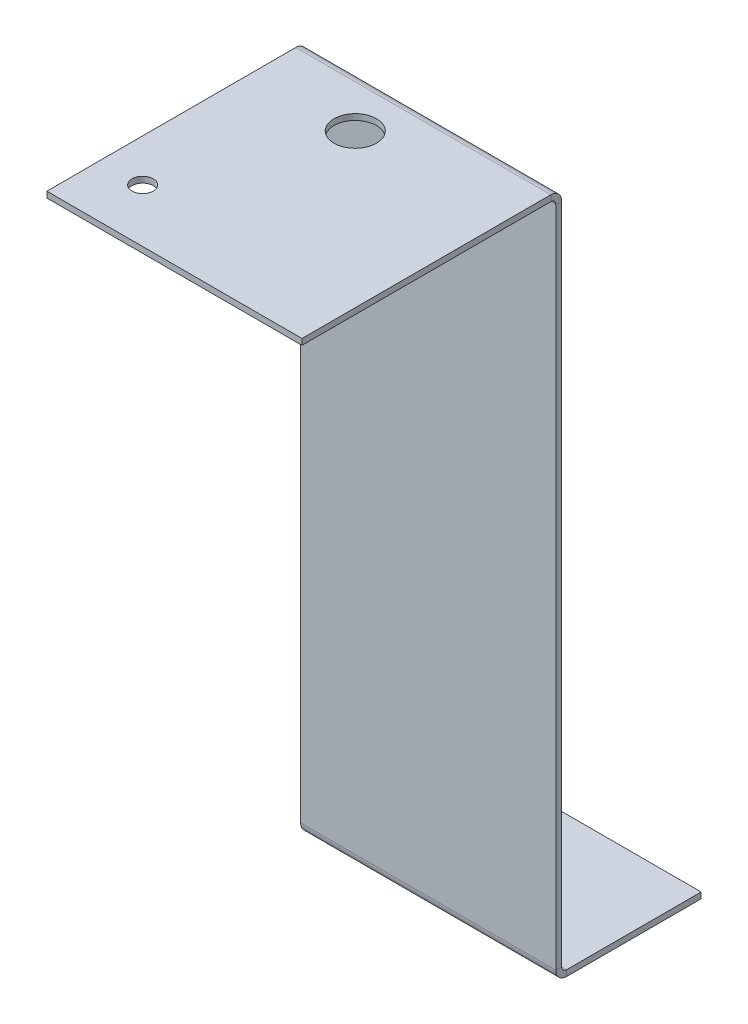
ISO-10303-21;
HEADER;
FILE_DESCRIPTION(('STEP AP214'),'2;1');
FILE_NAME('part.step','',(''),(''),'','','');
FILE_SCHEMA(('AUTOMOTIVE_DESIGN { 1 0 10303 214 1 1 1 1 }'));
ENDSEC;
DATA;
#1=APPLICATION_CONTEXT('core data for automotive mechanical design processes');
#2=APPLICATION_PROTOCOL_DEFINITION('international standard','automotive_design',2000,#1);
#3=PRODUCT_CONTEXT('',#1,'mechanical');
#4=PRODUCT('Part','Part','',(#3));
#5=PRODUCT_RELATED_PRODUCT_CATEGORY('part','',(#4));
#6=PRODUCT_DEFINITION_FORMATION('','',#4);
#7=PRODUCT_DEFINITION_CONTEXT('part definition',#1,'design');
#8=PRODUCT_DEFINITION('design','',#6,#7);
#9=PRODUCT_DEFINITION_SHAPE('','',#8);
#10=(LENGTH_UNIT() NAMED_UNIT(*) SI_UNIT(.MILLI.,.METRE.));
#11=(NAMED_UNIT(*) PLANE_ANGLE_UNIT() SI_UNIT($,.RADIAN.));
#12=(NAMED_UNIT(*) SI_UNIT($,.STERADIAN.) SOLID_ANGLE_UNIT());
#13=UNCERTAINTY_MEASURE_WITH_UNIT(LENGTH_MEASURE(1.E-05),#10,'distance_accuracy_value','');
#14=(GEOMETRIC_REPRESENTATION_CONTEXT(3) GLOBAL_UNCERTAINTY_ASSIGNED_CONTEXT((#13)) GLOBAL_UNIT_ASSIGNED_CONTEXT((#10,
#11,#12)) REPRESENTATION_CONTEXT('',''));
#15=CARTESIAN_POINT('',(0.,0.,0.));
#16=DIRECTION('',(0.,0.,1.));
#17=DIRECTION('',(1.,0.,0.));
#18=AXIS2_PLACEMENT_3D('',#15,#16,#17);
#19=CARTESIAN_POINT('',(38.1,0.,-0.889));
#20=DIRECTION('',(1.,0.,0.));
#21=DIRECTION('',(0.,1.,0.));
#22=AXIS2_PLACEMENT_3D('',#19,#20,#21);
#23=PLANE('',#22);
#24=DIRECTION('',(0.,1.,0.));
#25=VECTOR('',#24,1.);
#26=CARTESIAN_POINT('',(38.1,0.,0.));
#27=LINE('',#26,#25);
#28=CARTESIAN_POINT('',(38.1,-138.0744,0.));
#29=VERTEX_POINT('',#28);
#30=CARTESIAN_POINT('',(38.1,-39.0276337707887,0.));
#31=VERTEX_POINT('',#30);
#32=EDGE_CURVE('E287',#29,#31,#27,.T.);
#33=ORIENTED_EDGE('',*,*,#32,.F.);
#34=DIRECTION('',(0.,0.,-1.));
#35=VECTOR('',#34,1.);
#36=CARTESIAN_POINT('',(38.1,-138.0744,-0.889000000000964));
#37=LINE('',#36,#35);
#38=CARTESIAN_POINT('',(38.1,-138.0744,-0.889));
#39=VERTEX_POINT('',#38);
#40=EDGE_CURVE('E277',#29,#39,#37,.T.);
#41=ORIENTED_EDGE('',*,*,#40,.T.);
#42=DIRECTION('',(0.,1.,0.));
#43=VECTOR('',#42,1.);
#44=CARTESIAN_POINT('',(38.1,0.,-0.889));
#45=LINE('',#44,#43);
#46=CARTESIAN_POINT('',(38.1,-39.0276337707887,-0.888999999999999));
#47=VERTEX_POINT('',#46);
#48=EDGE_CURVE('E222',#39,#47,#45,.T.);
#49=ORIENTED_EDGE('',*,*,#48,.T.);
#50=DIRECTION('',(0.,0.,-1.));
#51=VECTOR('',#50,1.);
#52=CARTESIAN_POINT('',(38.1,-39.0276337707887,-0.889000000000273));
#53=LINE('',#52,#51);
#54=EDGE_CURVE('E223',#31,#47,#53,.T.);
#55=ORIENTED_EDGE('',*,*,#54,.F.);
#56=EDGE_LOOP('',(#33,#41,#49,#55));
#57=FACE_BOUND('',#56,.T.);
#58=ADVANCED_FACE('F49',(#57),#23,.T.);
#59=CARTESIAN_POINT('',(0.,0.,0.));
#60=DIRECTION('',(0.,0.,1.));
#61=DIRECTION('',(1.,0.,0.));
#62=AXIS2_PLACEMENT_3D('',#59,#60,#61);
#63=PLANE('',#62);
#64=DIRECTION('',(0.,-1.,0.));
#65=VECTOR('',#64,1.);
#66=CARTESIAN_POINT('',(0.,0.,0.));
#67=LINE('',#66,#65);
#68=CARTESIAN_POINT('',(0.,-39.0276337707887,0.));
#69=VERTEX_POINT('',#68);
#70=CARTESIAN_POINT('',(0.,-138.0744,0.));
#71=VERTEX_POINT('',#70);
#72=EDGE_CURVE('E290',#69,#71,#67,.T.);
#73=ORIENTED_EDGE('',*,*,#72,.T.);
#74=DIRECTION('',(1.,0.,0.));
#75=VECTOR('',#74,1.);
#76=CARTESIAN_POINT('',(0.,-138.0744,0.));
#77=LINE('',#76,#75);
#78=EDGE_CURVE('E59',#71,#29,#77,.T.);
#79=ORIENTED_EDGE('',*,*,#78,.T.);
#80=ORIENTED_EDGE('',*,*,#32,.T.);
#81=DIRECTION('',(1.,0.,0.));
#82=VECTOR('',#81,1.);
#83=CARTESIAN_POINT('',(0.,-39.0276337707887,0.));
#84=LINE('',#83,#82);
#85=EDGE_CURVE('E227',#69,#31,#84,.T.);
#86=ORIENTED_EDGE('',*,*,#85,.F.);
#87=EDGE_LOOP('',(#73,#79,#80,#86));
#88=FACE_BOUND('',#87,.T.);
#89=ADVANCED_FACE('F345',(#88),#63,.T.);
#90=CARTESIAN_POINT('',(0.,0.,-0.889));
#91=DIRECTION('',(-1.,0.,0.));
#92=DIRECTION('',(0.,-1.,0.));
#93=AXIS2_PLACEMENT_3D('',#90,#91,#92);
#94=PLANE('',#93);
#95=DIRECTION('',(0.,-1.,0.));
#96=VECTOR('',#95,1.);
#97=CARTESIAN_POINT('',(0.,0.,-0.889));
#98=LINE('',#97,#96);
#99=CARTESIAN_POINT('',(0.,-39.0276337707887,-0.889));
#100=VERTEX_POINT('',#99);
#101=CARTESIAN_POINT('',(0.,-138.0744,-0.888999999999998));
#102=VERTEX_POINT('',#101);
#103=EDGE_CURVE('E272',#100,#102,#98,.T.);
#104=ORIENTED_EDGE('',*,*,#103,.T.);
#105=DIRECTION('',(0.,0.,1.));
#106=VECTOR('',#105,1.);
#107=CARTESIAN_POINT('',(0.,-138.0744,-0.889000000000964));
#108=LINE('',#107,#106);
#109=EDGE_CURVE('E12',#102,#71,#108,.T.);
#110=ORIENTED_EDGE('',*,*,#109,.T.);
#111=ORIENTED_EDGE('',*,*,#72,.F.);
#112=DIRECTION('',(0.,0.,1.));
#113=VECTOR('',#112,1.);
#114=CARTESIAN_POINT('',(0.,-39.0276337707887,-0.889000000000273));
#115=LINE('',#114,#113);
#116=EDGE_CURVE('E211',#100,#69,#115,.T.);
#117=ORIENTED_EDGE('',*,*,#116,.F.);
#118=EDGE_LOOP('',(#104,#110,#111,#117));
#119=FACE_BOUND('',#118,.T.);
#120=ADVANCED_FACE('F51',(#119),#94,.T.);
#121=CARTESIAN_POINT('',(0.,-37.4020337707889,37.9089662292113));
#122=DIRECTION('',(-1.,0.,0.));
#123=DIRECTION('',(0.,0.,-1.));
#124=AXIS2_PLACEMENT_3D('',#121,#122,#123);
#125=PLANE('',#124);
#126=DIRECTION('',(0.,0.,-1.));
#127=VECTOR('',#126,1.);
#128=CARTESIAN_POINT('',(0.,-37.4020337707889,37.9089662292113));
#129=LINE('',#128,#127);
#130=CARTESIAN_POINT('',(0.,-37.4020337707889,37.9089662292113));
#131=VERTEX_POINT('',#130);
#132=CARTESIAN_POINT('',(0.,-37.4020337707887,0.736599999999997));
#133=VERTEX_POINT('',#132);
#134=EDGE_CURVE('E243',#131,#133,#129,.T.);
#135=ORIENTED_EDGE('',*,*,#134,.T.);
#136=DIRECTION('',(0.,-1.,0.));
#137=VECTOR('',#136,1.);
#138=CARTESIAN_POINT('',(0.,-37.4020337707885,0.736600000000004));
#139=LINE('',#138,#137);
#140=CARTESIAN_POINT('',(0.,-38.2910337707887,0.736599999999997));
#141=VERTEX_POINT('',#140);
#142=EDGE_CURVE('E261',#133,#141,#139,.T.);
#143=ORIENTED_EDGE('',*,*,#142,.T.);
#144=DIRECTION('',(0.,0.,-1.));
#145=VECTOR('',#144,1.);
#146=CARTESIAN_POINT('',(0.,-38.2910337707889,37.9089662292113));
#147=LINE('',#146,#145);
#148=CARTESIAN_POINT('',(0.,-38.2910337707889,37.9089662292113));
#149=VERTEX_POINT('',#148);
#150=EDGE_CURVE('E75',#149,#141,#147,.T.);
#151=ORIENTED_EDGE('',*,*,#150,.F.);
#152=DIRECTION('',(0.,-1.,0.));
#153=VECTOR('',#152,1.);
#154=CARTESIAN_POINT('',(0.,-37.4020337707889,37.9089662292113));
#155=LINE('',#154,#153);
#156=EDGE_CURVE('E245',#131,#149,#155,.T.);
#157=ORIENTED_EDGE('',*,*,#156,.F.);
#158=EDGE_LOOP('',(#135,#143,#151,#157));
#159=FACE_BOUND('',#158,.T.);
#160=ADVANCED_FACE('F318',(#159),#125,.T.);
#161=CARTESIAN_POINT('',(38.1,-37.4020337707889,37.9089662292113));
#162=DIRECTION('',(1.,0.,0.));
#163=DIRECTION('',(0.,0.,1.));
#164=AXIS2_PLACEMENT_3D('',#161,#162,#163);
#165=PLANE('',#164);
#166=DIRECTION('',(0.,0.,1.));
#167=VECTOR('',#166,1.);
#168=CARTESIAN_POINT('',(38.1,-38.2910337707889,37.9089662292113));
#169=LINE('',#168,#167);
#170=CARTESIAN_POINT('',(38.1,-38.2910337707888,0.736600000000004));
#171=VERTEX_POINT('',#170);
#172=CARTESIAN_POINT('',(38.1,-38.2910337707889,37.9089662292113));
#173=VERTEX_POINT('',#172);
#174=EDGE_CURVE('E244',#171,#173,#169,.T.);
#175=ORIENTED_EDGE('',*,*,#174,.F.);
#176=DIRECTION('',(0.,1.,0.));
#177=VECTOR('',#176,1.);
#178=CARTESIAN_POINT('',(38.1,-37.4020337707885,0.736600000000004));
#179=LINE('',#178,#177);
#180=CARTESIAN_POINT('',(38.1,-37.4020337707888,0.736600000000007));
#181=VERTEX_POINT('',#180);
#182=EDGE_CURVE('E255',#171,#181,#179,.T.);
#183=ORIENTED_EDGE('',*,*,#182,.T.);
#184=DIRECTION('',(0.,0.,1.));
#185=VECTOR('',#184,1.);
#186=CARTESIAN_POINT('',(38.1,-37.4020337707889,37.9089662292113));
#187=LINE('',#186,#185);
#188=CARTESIAN_POINT('',(38.1,-37.4020337707889,37.9089662292113));
#189=VERTEX_POINT('',#188);
#190=EDGE_CURVE('E239',#181,#189,#187,.T.);
#191=ORIENTED_EDGE('',*,*,#190,.T.);
#192=DIRECTION('',(0.,-1.,0.));
#193=VECTOR('',#192,1.);
#194=CARTESIAN_POINT('',(38.1,-37.4020337707889,37.9089662292113));
#195=LINE('',#194,#193);
#196=EDGE_CURVE('E238',#189,#173,#195,.T.);
#197=ORIENTED_EDGE('',*,*,#196,.T.);
#198=EDGE_LOOP('',(#175,#183,#191,#197));
#199=FACE_BOUND('',#198,.T.);
#200=ADVANCED_FACE('F328',(#199),#165,.T.);
#201=CARTESIAN_POINT('',(0.,-38.2910337707889,37.9089662292113));
#202=DIRECTION('',(0.,-1.,0.));
#203=DIRECTION('',(1.,0.,0.));
#204=AXIS2_PLACEMENT_3D('',#201,#202,#203);
#205=PLANE('',#204);
#206=CARTESIAN_POINT('',(15.24,-38.2910337707888,7.0866));
#207=DIRECTION('',(0.,-1.,0.));
#208=DIRECTION('',(0.,0.,-1.));
#209=AXIS2_PLACEMENT_3D('',#206,#207,#208);
#210=CIRCLE('',#209,3.175);
#211=CARTESIAN_POINT('',(15.24,-38.2910337707888,3.9116));
#212=VERTEX_POINT('',#211);
#213=EDGE_CURVE('E629',#212,#212,#210,.T.);
#214=ORIENTED_EDGE('',*,*,#213,.F.);
#215=EDGE_LOOP('',(#214));
#216=FACE_BOUND('',#215,.T.);
#217=CARTESIAN_POINT('',(6.34999999999996,-38.2910337707888,29.9466));
#218=DIRECTION('',(0.,-1.,0.));
#219=DIRECTION('',(0.,0.,-1.));
#220=AXIS2_PLACEMENT_3D('',#217,#218,#219);
#221=CIRCLE('',#220,1.58749999999999);
#222=CARTESIAN_POINT('',(6.34999999999996,-38.2910337707888,28.3591));
#223=VERTEX_POINT('',#222);
#224=EDGE_CURVE('E617',#223,#223,#221,.T.);
#225=ORIENTED_EDGE('',*,*,#224,.F.);
#226=EDGE_LOOP('',(#225));
#227=FACE_BOUND('',#226,.T.);
#228=ORIENTED_EDGE('',*,*,#150,.T.);
#229=DIRECTION('',(1.,0.,0.));
#230=VECTOR('',#229,1.);
#231=CARTESIAN_POINT('',(0.,-38.2910337707887,0.736599999999997));
#232=LINE('',#231,#230);
#233=EDGE_CURVE('E258',#141,#171,#232,.T.);
#234=ORIENTED_EDGE('',*,*,#233,.T.);
#235=ORIENTED_EDGE('',*,*,#174,.T.);
#236=DIRECTION('',(-1.,0.,0.));
#237=VECTOR('',#236,1.);
#238=CARTESIAN_POINT('',(0.,-38.2910337707889,37.9089662292113));
#239=LINE('',#238,#237);
#240=EDGE_CURVE('E240',#173,#149,#239,.T.);
#241=ORIENTED_EDGE('',*,*,#240,.T.);
#242=EDGE_LOOP('',(#228,#234,#235,#241));
#243=FACE_BOUND('',#242,.T.);
#244=ADVANCED_FACE('F326',(#216,#227,#243),#205,.T.);
#245=CARTESIAN_POINT('',(0.,-37.4020337707889,37.9089662292113));
#246=DIRECTION('',(0.,0.,1.));
#247=DIRECTION('',(0.,-1.,0.));
#248=AXIS2_PLACEMENT_3D('',#245,#246,#247);
#249=PLANE('',#248);
#250=ORIENTED_EDGE('',*,*,#240,.F.);
#251=ORIENTED_EDGE('',*,*,#196,.F.);
#252=DIRECTION('',(-1.,0.,0.));
#253=VECTOR('',#252,1.);
#254=CARTESIAN_POINT('',(0.,-37.4020337707889,37.9089662292113));
#255=LINE('',#254,#253);
#256=EDGE_CURVE('E234',#189,#131,#255,.T.);
#257=ORIENTED_EDGE('',*,*,#256,.T.);
#258=ORIENTED_EDGE('',*,*,#156,.T.);
#259=EDGE_LOOP('',(#250,#251,#257,#258));
#260=FACE_BOUND('',#259,.T.);
#261=ADVANCED_FACE('F332',(#260),#249,.T.);
#262=CARTESIAN_POINT('',(0.,-37.4020337707889,37.9089662292113));
#263=DIRECTION('',(0.,-1.,0.));
#264=DIRECTION('',(1.,0.,0.));
#265=AXIS2_PLACEMENT_3D('',#262,#263,#264);
#266=PLANE('',#265);
#267=CARTESIAN_POINT('',(15.24,-37.4020337707886,7.0866));
#268=DIRECTION('',(0.,-1.,0.));
#269=DIRECTION('',(0.,0.,-1.));
#270=AXIS2_PLACEMENT_3D('',#267,#268,#269);
#271=CIRCLE('',#270,3.17499999999999);
#272=CARTESIAN_POINT('',(15.24,-37.4020337707886,3.91160000000001));
#273=VERTEX_POINT('',#272);
#274=EDGE_CURVE('E625',#273,#273,#271,.T.);
#275=ORIENTED_EDGE('',*,*,#274,.T.);
#276=EDGE_LOOP('',(#275));
#277=FACE_BOUND('',#276,.T.);
#278=CARTESIAN_POINT('',(6.34999999999996,-37.4020337707887,29.9466));
#279=DIRECTION('',(0.,-1.,0.));
#280=DIRECTION('',(0.,0.,-1.));
#281=AXIS2_PLACEMENT_3D('',#278,#279,#280);
#282=CIRCLE('',#281,1.5875);
#283=CARTESIAN_POINT('',(6.34999999999996,-37.4020337707887,28.3591));
#284=VERTEX_POINT('',#283);
#285=EDGE_CURVE('E186',#284,#284,#282,.T.);
#286=ORIENTED_EDGE('',*,*,#285,.T.);
#287=EDGE_LOOP('',(#286));
#288=FACE_BOUND('',#287,.T.);
#289=DIRECTION('',(1.,0.,0.));
#290=VECTOR('',#289,1.);
#291=CARTESIAN_POINT('',(0.,-37.4020337707887,0.736600000000004));
#292=LINE('',#291,#290);
#293=EDGE_CURVE('E248',#133,#181,#292,.T.);
#294=ORIENTED_EDGE('',*,*,#293,.F.);
#295=ORIENTED_EDGE('',*,*,#134,.F.);
#296=ORIENTED_EDGE('',*,*,#256,.F.);
#297=ORIENTED_EDGE('',*,*,#190,.F.);
#298=EDGE_LOOP('',(#294,#295,#296,#297));
#299=FACE_BOUND('',#298,.T.);
#300=ADVANCED_FACE('F314',(#277,#288,#299),#266,.F.);
#301=CARTESIAN_POINT('',(0.,0.,-0.889));
#302=DIRECTION('',(0.,0.,1.));
#303=DIRECTION('',(1.,0.,0.));
#304=AXIS2_PLACEMENT_3D('',#301,#302,#303);
#305=PLANE('',#304);
#306=DIRECTION('',(1.,0.,0.));
#307=VECTOR('',#306,1.);
#308=CARTESIAN_POINT('',(0.,-138.0744,-0.889));
#309=LINE('',#308,#307);
#310=EDGE_CURVE('E264',#102,#39,#309,.T.);
#311=ORIENTED_EDGE('',*,*,#310,.F.);
#312=ORIENTED_EDGE('',*,*,#103,.F.);
#313=DIRECTION('',(1.,0.,0.));
#314=VECTOR('',#313,1.);
#315=CARTESIAN_POINT('',(0.,-39.0276337707887,-0.889));
#316=LINE('',#315,#314);
#317=EDGE_CURVE('E218',#100,#47,#316,.T.);
#318=ORIENTED_EDGE('',*,*,#317,.T.);
#319=ORIENTED_EDGE('',*,*,#48,.F.);
#320=EDGE_LOOP('',(#311,#312,#318,#319));
#321=FACE_BOUND('',#320,.T.);
#322=ADVANCED_FACE('F301',(#321),#305,.F.);
#323=CARTESIAN_POINT('',(0.,-39.0276337707887,0.7366));
#324=DIRECTION('',(-1.,0.,0.));
#325=DIRECTION('',(0.,-1.,0.));
#326=AXIS2_PLACEMENT_3D('',#323,#324,#325);
#327=PLANE('',#326);
#328=ORIENTED_EDGE('',*,*,#116,.T.);
#329=CARTESIAN_POINT('',(0.,-39.0276337707887,0.7366));
#330=DIRECTION('',(1.,0.,0.));
#331=DIRECTION('',(0.,1.,0.));
#332=AXIS2_PLACEMENT_3D('',#329,#330,#331);
#333=CIRCLE('',#332,0.7366);
#334=EDGE_CURVE('E196',#69,#141,#333,.T.);
#335=ORIENTED_EDGE('',*,*,#334,.T.);
#336=ORIENTED_EDGE('',*,*,#142,.F.);
#337=CARTESIAN_POINT('',(0.,-39.0276337707887,0.7366));
#338=DIRECTION('',(1.,0.,0.));
#339=DIRECTION('',(0.,-1.,0.));
#340=AXIS2_PLACEMENT_3D('',#337,#338,#339);
#341=CIRCLE('',#340,1.6256);
#342=EDGE_CURVE('E202',#100,#133,#341,.T.);
#343=ORIENTED_EDGE('',*,*,#342,.F.);
#344=EDGE_LOOP('',(#328,#335,#336,#343));
#345=FACE_BOUND('',#344,.T.);
#346=ADVANCED_FACE('F321',(#345),#327,.T.);
#347=CARTESIAN_POINT('',(38.1,-39.0276337707888,0.7366));
#348=DIRECTION('',(1.,0.,0.));
#349=DIRECTION('',(0.,0.,-1.));
#350=AXIS2_PLACEMENT_3D('',#347,#348,#349);
#351=PLANE('',#350);
#352=ORIENTED_EDGE('',*,*,#182,.F.);
#353=CARTESIAN_POINT('',(38.1,-39.0276337707888,0.7366));
#354=DIRECTION('',(1.,0.,0.));
#355=DIRECTION('',(0.,1.,0.));
#356=AXIS2_PLACEMENT_3D('',#353,#354,#355);
#357=CIRCLE('',#356,0.7366);
#358=EDGE_CURVE('E207',#171,#31,#357,.F.);
#359=ORIENTED_EDGE('',*,*,#358,.T.);
#360=ORIENTED_EDGE('',*,*,#54,.T.);
#361=CARTESIAN_POINT('',(38.1,-39.0276337707888,0.7366));
#362=DIRECTION('',(-1.,0.,0.));
#363=DIRECTION('',(0.,0.,-1.));
#364=AXIS2_PLACEMENT_3D('',#361,#362,#363);
#365=CIRCLE('',#364,1.6256);
#366=EDGE_CURVE('E206',#181,#47,#365,.T.);
#367=ORIENTED_EDGE('',*,*,#366,.F.);
#368=EDGE_LOOP('',(#352,#359,#360,#367));
#369=FACE_BOUND('',#368,.T.);
#370=ADVANCED_FACE('F307',(#369),#351,.T.);
#371=CARTESIAN_POINT('',(-19.1055020757273,-39.0276337707887,0.7366));
#372=DIRECTION('',(1.,0.,0.));
#373=DIRECTION('',(0.,1.,0.));
#374=AXIS2_PLACEMENT_3D('',#371,#372,#373);
#375=CYLINDRICAL_SURFACE('',#374,1.6256);
#376=ORIENTED_EDGE('',*,*,#366,.T.);
#377=ORIENTED_EDGE('',*,*,#317,.F.);
#378=ORIENTED_EDGE('',*,*,#342,.T.);
#379=ORIENTED_EDGE('',*,*,#293,.T.);
#380=EDGE_LOOP('',(#376,#377,#378,#379));
#381=FACE_BOUND('',#380,.T.);
#382=ADVANCED_FACE('F309',(#381),#375,.T.);
#383=CARTESIAN_POINT('',(-19.1055020757273,-39.0276337707887,0.7366));
#384=DIRECTION('',(1.,0.,0.));
#385=DIRECTION('',(0.,1.,0.));
#386=AXIS2_PLACEMENT_3D('',#383,#384,#385);
#387=CYLINDRICAL_SURFACE('',#386,0.7366);
#388=ORIENTED_EDGE('',*,*,#358,.F.);
#389=ORIENTED_EDGE('',*,*,#233,.F.);
#390=ORIENTED_EDGE('',*,*,#334,.F.);
#391=ORIENTED_EDGE('',*,*,#85,.T.);
#392=EDGE_LOOP('',(#388,#389,#390,#391));
#393=FACE_BOUND('',#392,.T.);
#394=ADVANCED_FACE('F324',(#393),#387,.F.);
#395=CARTESIAN_POINT('',(0.,-138.0744,-1.6256));
#396=DIRECTION('',(1.,0.,0.));
#397=DIRECTION('',(0.,0.,-1.));
#398=AXIS2_PLACEMENT_3D('',#395,#396,#397);
#399=PLANE('',#398);
#400=DIRECTION('',(0.,-1.,0.));
#401=VECTOR('',#400,1.);
#402=CARTESIAN_POINT('',(0.,-138.810999999999,-1.6256));
#403=LINE('',#402,#401);
#404=CARTESIAN_POINT('',(0.,-138.811,-1.6256));
#405=VERTEX_POINT('',#404);
#406=CARTESIAN_POINT('',(0.,-139.7,-1.6256));
#407=VERTEX_POINT('',#406);
#408=EDGE_CURVE('E149',#405,#407,#403,.T.);
#409=ORIENTED_EDGE('',*,*,#408,.T.);
#410=CARTESIAN_POINT('',(0.,-138.0744,-1.6256));
#411=DIRECTION('',(-1.,0.,0.));
#412=DIRECTION('',(0.,0.,1.));
#413=AXIS2_PLACEMENT_3D('',#410,#411,#412);
#414=CIRCLE('',#413,1.6256);
#415=EDGE_CURVE('E67',#407,#71,#414,.T.);
#416=ORIENTED_EDGE('',*,*,#415,.T.);
#417=ORIENTED_EDGE('',*,*,#109,.F.);
#418=CARTESIAN_POINT('',(0.,-138.0744,-1.6256));
#419=DIRECTION('',(-1.,0.,0.));
#420=DIRECTION('',(0.,0.,-1.));
#421=AXIS2_PLACEMENT_3D('',#418,#419,#420);
#422=CIRCLE('',#421,0.736600000000002);
#423=EDGE_CURVE('E187',#405,#102,#422,.T.);
#424=ORIENTED_EDGE('',*,*,#423,.F.);
#425=EDGE_LOOP('',(#409,#416,#417,#424));
#426=FACE_BOUND('',#425,.T.);
#427=ADVANCED_FACE('F452',(#426),#399,.F.);
#428=CARTESIAN_POINT('',(38.1,-138.0744,-1.6256));
#429=DIRECTION('',(-1.,0.,0.));
#430=DIRECTION('',(0.,0.,1.));
#431=AXIS2_PLACEMENT_3D('',#428,#429,#430);
#432=PLANE('',#431);
#433=ORIENTED_EDGE('',*,*,#40,.F.);
#434=CARTESIAN_POINT('',(38.1,-138.0744,-1.6256));
#435=DIRECTION('',(-1.,0.,0.));
#436=DIRECTION('',(0.,0.,1.));
#437=AXIS2_PLACEMENT_3D('',#434,#435,#436);
#438=CIRCLE('',#437,1.6256);
#439=CARTESIAN_POINT('',(38.1,-139.7,-1.6256));
#440=VERTEX_POINT('',#439);
#441=EDGE_CURVE('E192',#29,#440,#438,.F.);
#442=ORIENTED_EDGE('',*,*,#441,.T.);
#443=DIRECTION('',(0.,1.,0.));
#444=VECTOR('',#443,1.);
#445=CARTESIAN_POINT('',(38.1,-138.810999999999,-1.6256));
#446=LINE('',#445,#444);
#447=CARTESIAN_POINT('',(38.1,-138.811,-1.62559999999999));
#448=VERTEX_POINT('',#447);
#449=EDGE_CURVE('E170',#440,#448,#446,.T.);
#450=ORIENTED_EDGE('',*,*,#449,.T.);
#451=CARTESIAN_POINT('',(38.1,-138.0744,-1.6256));
#452=DIRECTION('',(1.,0.,0.));
#453=DIRECTION('',(0.,0.,1.));
#454=AXIS2_PLACEMENT_3D('',#451,#452,#453);
#455=CIRCLE('',#454,0.736600000000002);
#456=EDGE_CURVE('E191',#39,#448,#455,.T.);
#457=ORIENTED_EDGE('',*,*,#456,.F.);
#458=EDGE_LOOP('',(#433,#442,#450,#457));
#459=FACE_BOUND('',#458,.T.);
#460=ADVANCED_FACE('F445',(#459),#432,.F.);
#461=CARTESIAN_POINT('',(57.2055020757273,-138.0744,-1.6256));
#462=DIRECTION('',(-1.,0.,0.));
#463=DIRECTION('',(0.,0.,1.));
#464=AXIS2_PLACEMENT_3D('',#461,#462,#463);
#465=CYLINDRICAL_SURFACE('',#464,0.7366);
#466=ORIENTED_EDGE('',*,*,#456,.T.);
#467=DIRECTION('',(1.,0.,0.));
#468=VECTOR('',#467,1.);
#469=CARTESIAN_POINT('',(0.,-138.811,-1.6256));
#470=LINE('',#469,#468);
#471=EDGE_CURVE('E174',#405,#448,#470,.T.);
#472=ORIENTED_EDGE('',*,*,#471,.F.);
#473=ORIENTED_EDGE('',*,*,#423,.T.);
#474=ORIENTED_EDGE('',*,*,#310,.T.);
#475=EDGE_LOOP('',(#466,#472,#473,#474));
#476=FACE_BOUND('',#475,.T.);
#477=ADVANCED_FACE('F442',(#476),#465,.F.);
#478=CARTESIAN_POINT('',(57.2055020757273,-138.0744,-1.6256));
#479=DIRECTION('',(-1.,0.,0.));
#480=DIRECTION('',(0.,0.,1.));
#481=AXIS2_PLACEMENT_3D('',#478,#479,#480);
#482=CYLINDRICAL_SURFACE('',#481,1.6256);
#483=ORIENTED_EDGE('',*,*,#441,.F.);
#484=ORIENTED_EDGE('',*,*,#78,.F.);
#485=ORIENTED_EDGE('',*,*,#415,.F.);
#486=DIRECTION('',(1.,0.,0.));
#487=VECTOR('',#486,1.);
#488=CARTESIAN_POINT('',(0.,-139.7,-1.6256));
#489=LINE('',#488,#487);
#490=EDGE_CURVE('E177',#407,#440,#489,.T.);
#491=ORIENTED_EDGE('',*,*,#490,.T.);
#492=EDGE_LOOP('',(#483,#484,#485,#491));
#493=FACE_BOUND('',#492,.T.);
#494=ADVANCED_FACE('F437',(#493),#482,.T.);
#495=CARTESIAN_POINT('',(0.,-138.811,-21.7159324584225));
#496=DIRECTION('',(0.,0.,-1.));
#497=DIRECTION('',(0.,1.,0.));
#498=AXIS2_PLACEMENT_3D('',#495,#496,#497);
#499=PLANE('',#498);
#500=DIRECTION('',(1.,0.,0.));
#501=VECTOR('',#500,1.);
#502=CARTESIAN_POINT('',(0.,-139.7,-21.7159324584225));
#503=LINE('',#502,#501);
#504=CARTESIAN_POINT('',(0.,-139.7,-21.7159324584225));
#505=VERTEX_POINT('',#504);
#506=CARTESIAN_POINT('',(38.1,-139.7,-21.7159324584225));
#507=VERTEX_POINT('',#506);
#508=EDGE_CURVE('E162',#505,#507,#503,.T.);
#509=ORIENTED_EDGE('',*,*,#508,.F.);
#510=DIRECTION('',(0.,-1.,0.));
#511=VECTOR('',#510,1.);
#512=CARTESIAN_POINT('',(0.,-138.811,-21.7159324584225));
#513=LINE('',#512,#511);
#514=CARTESIAN_POINT('',(0.,-138.811,-21.7159324584225));
#515=VERTEX_POINT('',#514);
#516=EDGE_CURVE('E147',#515,#505,#513,.T.);
#517=ORIENTED_EDGE('',*,*,#516,.F.);
#518=DIRECTION('',(1.,0.,0.));
#519=VECTOR('',#518,1.);
#520=CARTESIAN_POINT('',(0.,-138.811,-21.7159324584225));
#521=LINE('',#520,#519);
#522=CARTESIAN_POINT('',(38.1,-138.811,-21.7159324584225));
#523=VERTEX_POINT('',#522);
#524=EDGE_CURVE('E160',#515,#523,#521,.T.);
#525=ORIENTED_EDGE('',*,*,#524,.T.);
#526=DIRECTION('',(0.,-1.,0.));
#527=VECTOR('',#526,1.);
#528=CARTESIAN_POINT('',(38.1,-138.811,-21.7159324584225));
#529=LINE('',#528,#527);
#530=EDGE_CURVE('E169',#523,#507,#529,.T.);
#531=ORIENTED_EDGE('',*,*,#530,.T.);
#532=EDGE_LOOP('',(#509,#517,#525,#531));
#533=FACE_BOUND('',#532,.T.);
#534=ADVANCED_FACE('F159',(#533),#499,.T.);
#535=CARTESIAN_POINT('',(0.,-138.811000000001,138.304067541577));
#536=DIRECTION('',(0.,-1.,0.));
#537=DIRECTION('',(1.,0.,0.));
#538=AXIS2_PLACEMENT_3D('',#535,#536,#537);
#539=PLANE('',#538);
#540=CARTESIAN_POINT('',(19.0499999999965,-138.811,-11.6707662292066));
#541=DIRECTION('',(0.,-1.,0.));
#542=DIRECTION('',(0.,0.,-1.));
#543=AXIS2_PLACEMENT_3D('',#540,#541,#542);
#544=CIRCLE('',#543,3.17499999999999);
#545=CARTESIAN_POINT('',(19.0499999999965,-138.811,-14.8457662292066));
#546=VERTEX_POINT('',#545);
#547=EDGE_CURVE('E53',#546,#546,#544,.T.);
#548=ORIENTED_EDGE('',*,*,#547,.T.);
#549=EDGE_LOOP('',(#548));
#550=FACE_BOUND('',#549,.T.);
#551=DIRECTION('',(0.,0.,-1.));
#552=VECTOR('',#551,1.);
#553=CARTESIAN_POINT('',(0.,-138.811000000001,138.304067541577));
#554=LINE('',#553,#552);
#555=EDGE_CURVE('E144',#405,#515,#554,.T.);
#556=ORIENTED_EDGE('',*,*,#555,.F.);
#557=ORIENTED_EDGE('',*,*,#471,.T.);
#558=DIRECTION('',(0.,0.,1.));
#559=VECTOR('',#558,1.);
#560=CARTESIAN_POINT('',(38.1,-138.811000000001,138.304067541577));
#561=LINE('',#560,#559);
#562=EDGE_CURVE('E167',#523,#448,#561,.T.);
#563=ORIENTED_EDGE('',*,*,#562,.F.);
#564=ORIENTED_EDGE('',*,*,#524,.F.);
#565=EDGE_LOOP('',(#556,#557,#563,#564));
#566=FACE_BOUND('',#565,.T.);
#567=ADVANCED_FACE('F166',(#550,#566),#539,.F.);
#568=CARTESIAN_POINT('',(38.1,-138.811000000001,138.304067541577));
#569=DIRECTION('',(1.,0.,0.));
#570=DIRECTION('',(0.,0.,1.));
#571=AXIS2_PLACEMENT_3D('',#568,#569,#570);
#572=PLANE('',#571);
#573=ORIENTED_EDGE('',*,*,#449,.F.);
#574=DIRECTION('',(0.,0.,1.));
#575=VECTOR('',#574,1.);
#576=CARTESIAN_POINT('',(38.1,-139.700000000001,138.304067541577));
#577=LINE('',#576,#575);
#578=EDGE_CURVE('E155',#507,#440,#577,.T.);
#579=ORIENTED_EDGE('',*,*,#578,.F.);
#580=ORIENTED_EDGE('',*,*,#530,.F.);
#581=ORIENTED_EDGE('',*,*,#562,.T.);
#582=EDGE_LOOP('',(#573,#579,#580,#581));
#583=FACE_BOUND('',#582,.T.);
#584=ADVANCED_FACE('F391',(#583),#572,.T.);
#585=CARTESIAN_POINT('',(0.,-139.700000000001,138.304067541577));
#586=DIRECTION('',(0.,-1.,0.));
#587=DIRECTION('',(1.,0.,0.));
#588=AXIS2_PLACEMENT_3D('',#585,#586,#587);
#589=PLANE('',#588);
#590=CARTESIAN_POINT('',(19.0499999999965,-139.7,-11.6707662292066));
#591=DIRECTION('',(0.,-1.,0.));
#592=DIRECTION('',(0.,0.,-1.));
#593=AXIS2_PLACEMENT_3D('',#590,#591,#592);
#594=CIRCLE('',#593,3.175);
#595=CARTESIAN_POINT('',(19.0499999999965,-139.7,-14.8457662292066));
#596=VERTEX_POINT('',#595);
#597=EDGE_CURVE('E621',#596,#596,#594,.T.);
#598=ORIENTED_EDGE('',*,*,#597,.F.);
#599=EDGE_LOOP('',(#598));
#600=FACE_BOUND('',#599,.T.);
#601=ORIENTED_EDGE('',*,*,#490,.F.);
#602=DIRECTION('',(0.,0.,-1.));
#603=VECTOR('',#602,1.);
#604=CARTESIAN_POINT('',(0.,-139.700000000001,138.304067541577));
#605=LINE('',#604,#603);
#606=EDGE_CURVE('E605',#407,#505,#605,.T.);
#607=ORIENTED_EDGE('',*,*,#606,.T.);
#608=ORIENTED_EDGE('',*,*,#508,.T.);
#609=ORIENTED_EDGE('',*,*,#578,.T.);
#610=EDGE_LOOP('',(#601,#607,#608,#609));
#611=FACE_BOUND('',#610,.T.);
#612=ADVANCED_FACE('F402',(#600,#611),#589,.T.);
#613=CARTESIAN_POINT('',(0.,-138.811000000001,138.304067541577));
#614=DIRECTION('',(-1.,0.,0.));
#615=DIRECTION('',(0.,0.,-1.));
#616=AXIS2_PLACEMENT_3D('',#613,#614,#615);
#617=PLANE('',#616);
#618=ORIENTED_EDGE('',*,*,#408,.F.);
#619=ORIENTED_EDGE('',*,*,#555,.T.);
#620=ORIENTED_EDGE('',*,*,#516,.T.);
#621=ORIENTED_EDGE('',*,*,#606,.F.);
#622=EDGE_LOOP('',(#618,#619,#620,#621));
#623=FACE_BOUND('',#622,.T.);
#624=ADVANCED_FACE('F146',(#623),#617,.T.);
#625=CARTESIAN_POINT('',(6.34999999999996,-38.2910337707888,29.9466));
#626=DIRECTION('',(0.,-1.,0.));
#627=DIRECTION('',(0.,0.,-1.));
#628=AXIS2_PLACEMENT_3D('',#625,#626,#627);
#629=CYLINDRICAL_SURFACE('',#628,1.58749999999999);
#630=ORIENTED_EDGE('',*,*,#285,.F.);
#631=EDGE_LOOP('',(#630));
#632=FACE_BOUND('',#631,.T.);
#633=ORIENTED_EDGE('',*,*,#224,.T.);
#634=EDGE_LOOP('',(#633));
#635=FACE_BOUND('',#634,.T.);
#636=ADVANCED_FACE('F375',(#632,#635),#629,.F.);
#637=CARTESIAN_POINT('',(19.0499999999965,-139.7,-11.6707662292066));
#638=DIRECTION('',(0.,-1.,0.));
#639=DIRECTION('',(0.,0.,-1.));
#640=AXIS2_PLACEMENT_3D('',#637,#638,#639);
#641=CYLINDRICAL_SURFACE('',#640,3.17499999999999);
#642=ORIENTED_EDGE('',*,*,#597,.T.);
#643=EDGE_LOOP('',(#642));
#644=FACE_BOUND('',#643,.T.);
#645=ORIENTED_EDGE('',*,*,#547,.F.);
#646=EDGE_LOOP('',(#645));
#647=FACE_BOUND('',#646,.T.);
#648=ADVANCED_FACE('F413',(#644,#647),#641,.F.);
#649=CARTESIAN_POINT('',(15.24,-38.2910337707888,7.0866));
#650=DIRECTION('',(0.,-1.,0.));
#651=DIRECTION('',(0.,0.,-1.));
#652=AXIS2_PLACEMENT_3D('',#649,#650,#651);
#653=CYLINDRICAL_SURFACE('',#652,3.17499999999999);
#654=ORIENTED_EDGE('',*,*,#274,.F.);
#655=EDGE_LOOP('',(#654));
#656=FACE_BOUND('',#655,.T.);
#657=ORIENTED_EDGE('',*,*,#213,.T.);
#658=EDGE_LOOP('',(#657));
#659=FACE_BOUND('',#658,.T.);
#660=ADVANCED_FACE('F418',(#656,#659),#653,.F.);
#661=CLOSED_SHELL('',(#58,#89,#120,#160,#200,#244,#261,#300,#322,#346,#370,#382,#394,#427,#460,
#477,#494,#534,#567,#584,#612,#624,#636,#648,#660));
#662=MANIFOLD_SOLID_BREP('B2',#661);
#663=ADVANCED_BREP_SHAPE_REPRESENTATION('',(#18,#662),#14);
#664=SHAPE_DEFINITION_REPRESENTATION(#9,#663);
ENDSEC;
END-ISO-10303-21;
